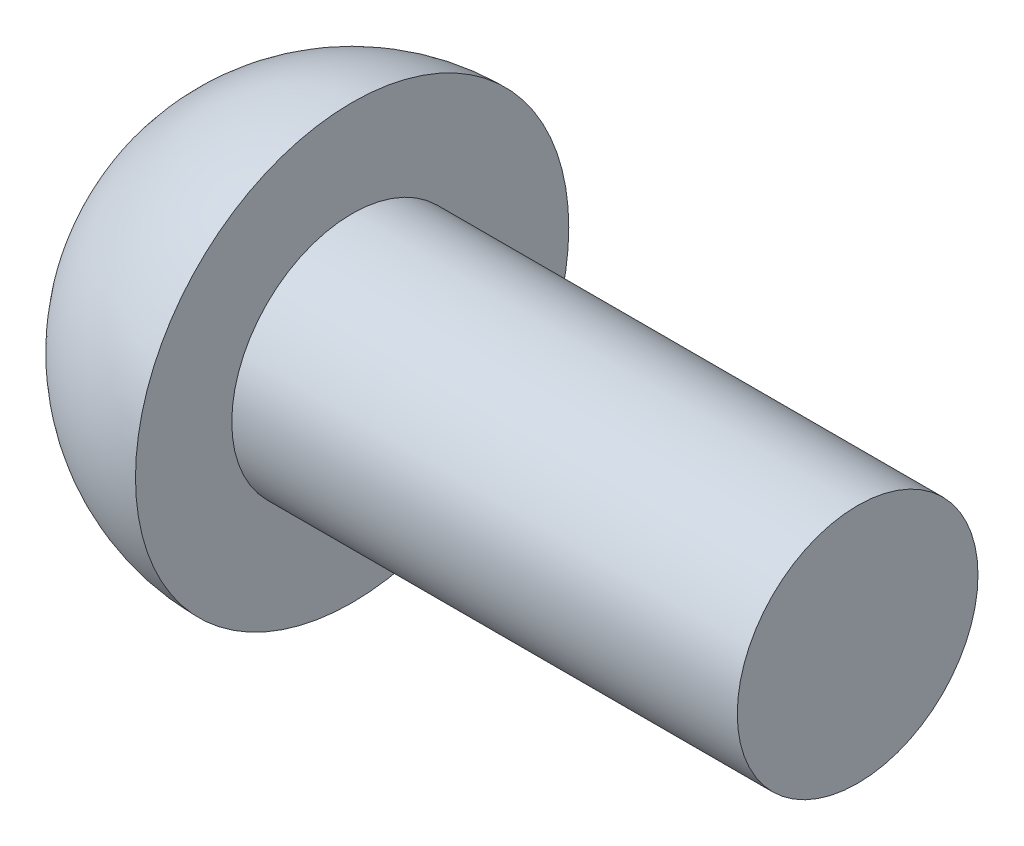
ISO-10303-21;
HEADER;
FILE_DESCRIPTION(('STEP AP214'),'2;1');
FILE_NAME('part.step','',(''),(''),'','','');
FILE_SCHEMA(('AUTOMOTIVE_DESIGN { 1 0 10303 214 1 1 1 1 }'));
ENDSEC;
DATA;
#1=APPLICATION_CONTEXT('core data for automotive mechanical design processes');
#2=APPLICATION_PROTOCOL_DEFINITION('international standard','automotive_design',2000,#1);
#3=PRODUCT_CONTEXT('',#1,'mechanical');
#4=PRODUCT('Part','Part','',(#3));
#5=PRODUCT_RELATED_PRODUCT_CATEGORY('part','',(#4));
#6=PRODUCT_DEFINITION_FORMATION('','',#4);
#7=PRODUCT_DEFINITION_CONTEXT('part definition',#1,'design');
#8=PRODUCT_DEFINITION('design','',#6,#7);
#9=PRODUCT_DEFINITION_SHAPE('','',#8);
#10=(LENGTH_UNIT() NAMED_UNIT(*) SI_UNIT(.MILLI.,.METRE.));
#11=(NAMED_UNIT(*) PLANE_ANGLE_UNIT() SI_UNIT($,.RADIAN.));
#12=(NAMED_UNIT(*) SI_UNIT($,.STERADIAN.) SOLID_ANGLE_UNIT());
#13=UNCERTAINTY_MEASURE_WITH_UNIT(LENGTH_MEASURE(1.E-05),#10,'distance_accuracy_value','');
#14=(GEOMETRIC_REPRESENTATION_CONTEXT(3) GLOBAL_UNCERTAINTY_ASSIGNED_CONTEXT((#13)) GLOBAL_UNIT_ASSIGNED_CONTEXT((#10,
#11,#12)) REPRESENTATION_CONTEXT('',''));
#15=CARTESIAN_POINT('',(0.,0.,0.));
#16=DIRECTION('',(0.,0.,1.));
#17=DIRECTION('',(1.,0.,0.));
#18=AXIS2_PLACEMENT_3D('',#15,#16,#17);
#19=CARTESIAN_POINT('',(0.,0.,0.));
#20=DIRECTION('',(-1.,0.,0.));
#21=DIRECTION('',(0.,-1.,0.));
#22=AXIS2_PLACEMENT_3D('',#19,#20,#21);
#23=PLANE('',#22);
#24=CARTESIAN_POINT('',(0.,0.,0.));
#25=DIRECTION('',(-1.,0.,0.));
#26=DIRECTION('',(0.,-1.,0.));
#27=AXIS2_PLACEMENT_3D('',#24,#25,#26);
#28=CIRCLE('',#27,5.);
#29=CARTESIAN_POINT('',(0.,-5.,0.));
#30=VERTEX_POINT('',#29);
#31=EDGE_CURVE('E10',#30,#30,#28,.T.);
#32=ORIENTED_EDGE('',*,*,#31,.F.);
#33=EDGE_LOOP('',(#32));
#34=FACE_BOUND('',#33,.T.);
#35=ADVANCED_FACE('F34',(#34),#23,.F.);
#36=CARTESIAN_POINT('',(-30.,0.,0.));
#37=DIRECTION('',(-1.,0.,0.));
#38=DIRECTION('',(0.,-1.,0.));
#39=AXIS2_PLACEMENT_3D('',#36,#37,#38);
#40=CYLINDRICAL_SURFACE('',#39,5.);
#41=CARTESIAN_POINT('',(-21.,0.,0.));
#42=DIRECTION('',(-1.,0.,0.));
#43=DIRECTION('',(0.,-1.,0.));
#44=AXIS2_PLACEMENT_3D('',#41,#42,#43);
#45=CIRCLE('',#44,5.);
#46=CARTESIAN_POINT('',(-21.,-5.,0.));
#47=VERTEX_POINT('',#46);
#48=EDGE_CURVE('E41',#47,#47,#45,.T.);
#49=ORIENTED_EDGE('',*,*,#48,.F.);
#50=EDGE_LOOP('',(#49));
#51=FACE_BOUND('',#50,.T.);
#52=ORIENTED_EDGE('',*,*,#31,.T.);
#53=EDGE_LOOP('',(#52));
#54=FACE_BOUND('',#53,.T.);
#55=ADVANCED_FACE('F61',(#51,#54),#40,.T.);
#56=CARTESIAN_POINT('',(-21.,5.,0.));
#57=DIRECTION('',(-1.,0.,0.));
#58=DIRECTION('',(0.,-1.,0.));
#59=AXIS2_PLACEMENT_3D('',#56,#57,#58);
#60=PLANE('',#59);
#61=CARTESIAN_POINT('',(-21.,0.,0.));
#62=DIRECTION('',(-1.,0.,0.));
#63=DIRECTION('',(0.,-1.,0.));
#64=AXIS2_PLACEMENT_3D('',#61,#62,#63);
#65=CIRCLE('',#64,9.);
#66=CARTESIAN_POINT('',(-21.,-9.,0.));
#67=VERTEX_POINT('',#66);
#68=EDGE_CURVE('E47',#67,#67,#65,.T.);
#69=ORIENTED_EDGE('',*,*,#68,.F.);
#70=EDGE_LOOP('',(#69));
#71=FACE_BOUND('',#70,.T.);
#72=ORIENTED_EDGE('',*,*,#48,.T.);
#73=EDGE_LOOP('',(#72));
#74=FACE_BOUND('',#73,.T.);
#75=ADVANCED_FACE('F59',(#71,#74),#60,.F.);
#76=CARTESIAN_POINT('',(-21.,0.,0.));
#77=DIRECTION('',(-1.,0.,0.));
#78=DIRECTION('',(0.,1.,0.));
#79=AXIS2_PLACEMENT_3D('',#76,#77,#78);
#80=SPHERICAL_SURFACE('',#79,9.);
#81=ORIENTED_EDGE('',*,*,#68,.T.);
#82=EDGE_LOOP('',(#81));
#83=FACE_BOUND('',#82,.T.);
#84=ADVANCED_FACE('F57',(#83),#80,.T.);
#85=CLOSED_SHELL('',(#35,#55,#75,#84));
#86=MANIFOLD_SOLID_BREP('B2',#85);
#87=ADVANCED_BREP_SHAPE_REPRESENTATION('',(#18,#86),#14);
#88=SHAPE_DEFINITION_REPRESENTATION(#9,#87);
ENDSEC;
END-ISO-10303-21;
